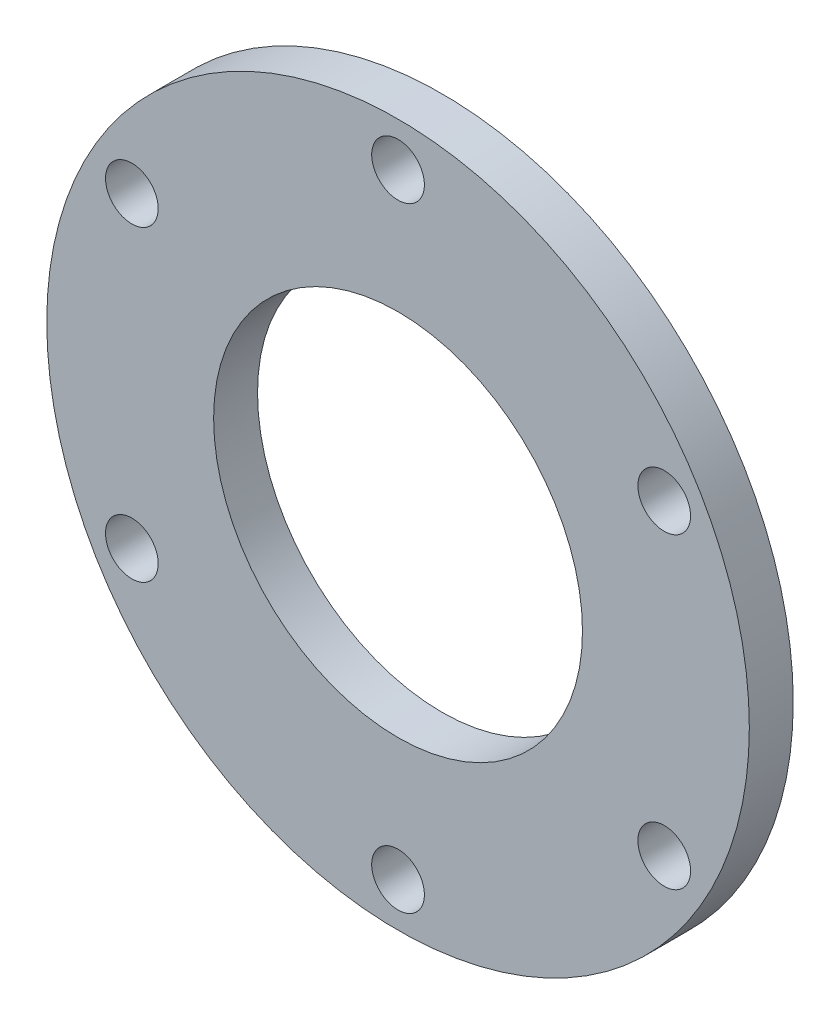
ISO-10303-21;
HEADER;
FILE_DESCRIPTION(('STEP AP214'),'2;1');
FILE_NAME('part.step','',(''),(''),'','','');
FILE_SCHEMA(('AUTOMOTIVE_DESIGN { 1 0 10303 214 1 1 1 1 }'));
ENDSEC;
DATA;
#1=APPLICATION_CONTEXT('core data for automotive mechanical design processes');
#2=APPLICATION_PROTOCOL_DEFINITION('international standard','automotive_design',2000,#1);
#3=PRODUCT_CONTEXT('',#1,'mechanical');
#4=PRODUCT('Part','Part','',(#3));
#5=PRODUCT_RELATED_PRODUCT_CATEGORY('part','',(#4));
#6=PRODUCT_DEFINITION_FORMATION('','',#4);
#7=PRODUCT_DEFINITION_CONTEXT('part definition',#1,'design');
#8=PRODUCT_DEFINITION('design','',#6,#7);
#9=PRODUCT_DEFINITION_SHAPE('','',#8);
#10=(LENGTH_UNIT() NAMED_UNIT(*) SI_UNIT(.MILLI.,.METRE.));
#11=(NAMED_UNIT(*) PLANE_ANGLE_UNIT() SI_UNIT($,.RADIAN.));
#12=(NAMED_UNIT(*) SI_UNIT($,.STERADIAN.) SOLID_ANGLE_UNIT());
#13=UNCERTAINTY_MEASURE_WITH_UNIT(LENGTH_MEASURE(1.E-05),#10,'distance_accuracy_value','');
#14=(GEOMETRIC_REPRESENTATION_CONTEXT(3) GLOBAL_UNCERTAINTY_ASSIGNED_CONTEXT((#13)) GLOBAL_UNIT_ASSIGNED_CONTEXT((#10,
#11,#12)) REPRESENTATION_CONTEXT('',''));
#15=CARTESIAN_POINT('',(0.,0.,0.));
#16=DIRECTION('',(0.,0.,1.));
#17=DIRECTION('',(1.,0.,0.));
#18=AXIS2_PLACEMENT_3D('',#15,#16,#17);
#19=CARTESIAN_POINT('',(0.,0.,-3.175));
#20=DIRECTION('',(0.,0.,1.));
#21=DIRECTION('',(1.,0.,0.));
#22=AXIS2_PLACEMENT_3D('',#19,#20,#21);
#23=CYLINDRICAL_SURFACE('',#22,25.4);
#24=CARTESIAN_POINT('',(0.,0.,-3.175));
#25=DIRECTION('',(0.,0.,1.));
#26=DIRECTION('',(1.,0.,0.));
#27=AXIS2_PLACEMENT_3D('',#24,#25,#26);
#28=CIRCLE('',#27,25.4);
#29=CARTESIAN_POINT('',(25.4,0.,-3.175));
#30=VERTEX_POINT('',#29);
#31=EDGE_CURVE('E10',#30,#30,#28,.T.);
#32=ORIENTED_EDGE('',*,*,#31,.T.);
#33=EDGE_LOOP('',(#32));
#34=FACE_BOUND('',#33,.T.);
#35=CARTESIAN_POINT('',(0.,0.,0.));
#36=DIRECTION('',(0.,0.,1.));
#37=DIRECTION('',(1.,0.,0.));
#38=AXIS2_PLACEMENT_3D('',#35,#36,#37);
#39=CIRCLE('',#38,25.4);
#40=CARTESIAN_POINT('',(25.4,0.,0.));
#41=VERTEX_POINT('',#40);
#42=EDGE_CURVE('E38',#41,#41,#39,.T.);
#43=ORIENTED_EDGE('',*,*,#42,.F.);
#44=EDGE_LOOP('',(#43));
#45=FACE_BOUND('',#44,.T.);
#46=ADVANCED_FACE('F35',(#34,#45),#23,.T.);
#47=CARTESIAN_POINT('',(0.,0.,-3.175));
#48=DIRECTION('',(0.,0.,1.));
#49=DIRECTION('',(1.,0.,0.));
#50=AXIS2_PLACEMENT_3D('',#47,#48,#49);
#51=PLANE('',#50);
#52=CARTESIAN_POINT('',(-19.2474145991092,11.1125,-3.175));
#53=DIRECTION('',(0.,0.,1.));
#54=DIRECTION('',(1.,0.,0.));
#55=AXIS2_PLACEMENT_3D('',#52,#53,#54);
#56=CIRCLE('',#55,1.905);
#57=CARTESIAN_POINT('',(-17.3424145991092,11.1125,-3.175));
#58=VERTEX_POINT('',#57);
#59=EDGE_CURVE('E80',#58,#58,#56,.T.);
#60=ORIENTED_EDGE('',*,*,#59,.T.);
#61=EDGE_LOOP('',(#60));
#62=FACE_BOUND('',#61,.T.);
#63=CARTESIAN_POINT('',(-19.2474145991091,-11.1125,-3.175));
#64=DIRECTION('',(0.,0.,1.));
#65=DIRECTION('',(1.,0.,0.));
#66=AXIS2_PLACEMENT_3D('',#63,#64,#65);
#67=CIRCLE('',#66,1.905);
#68=CARTESIAN_POINT('',(-17.3424145991091,-11.1125,-3.175));
#69=VERTEX_POINT('',#68);
#70=EDGE_CURVE('E74',#69,#69,#67,.T.);
#71=ORIENTED_EDGE('',*,*,#70,.T.);
#72=EDGE_LOOP('',(#71));
#73=FACE_BOUND('',#72,.T.);
#74=CARTESIAN_POINT('',(0.,-22.225,-3.175));
#75=DIRECTION('',(0.,0.,1.));
#76=DIRECTION('',(1.,0.,0.));
#77=AXIS2_PLACEMENT_3D('',#74,#75,#76);
#78=CIRCLE('',#77,1.905);
#79=CARTESIAN_POINT('',(1.905,-22.225,-3.175));
#80=VERTEX_POINT('',#79);
#81=EDGE_CURVE('E68',#80,#80,#78,.T.);
#82=ORIENTED_EDGE('',*,*,#81,.T.);
#83=EDGE_LOOP('',(#82));
#84=FACE_BOUND('',#83,.T.);
#85=CARTESIAN_POINT('',(19.2474145991092,-11.1125,-3.175));
#86=DIRECTION('',(0.,0.,1.));
#87=DIRECTION('',(1.,0.,0.));
#88=AXIS2_PLACEMENT_3D('',#85,#86,#87);
#89=CIRCLE('',#88,1.905);
#90=CARTESIAN_POINT('',(21.1524145991092,-11.1125,-3.175));
#91=VERTEX_POINT('',#90);
#92=EDGE_CURVE('E62',#91,#91,#89,.T.);
#93=ORIENTED_EDGE('',*,*,#92,.T.);
#94=EDGE_LOOP('',(#93));
#95=FACE_BOUND('',#94,.T.);
#96=CARTESIAN_POINT('',(19.2474145991091,11.1125,-3.175));
#97=DIRECTION('',(0.,0.,1.));
#98=DIRECTION('',(1.,0.,0.));
#99=AXIS2_PLACEMENT_3D('',#96,#97,#98);
#100=CIRCLE('',#99,1.905);
#101=CARTESIAN_POINT('',(21.1524145991091,11.1125,-3.175));
#102=VERTEX_POINT('',#101);
#103=EDGE_CURVE('E56',#102,#102,#100,.T.);
#104=ORIENTED_EDGE('',*,*,#103,.T.);
#105=EDGE_LOOP('',(#104));
#106=FACE_BOUND('',#105,.T.);
#107=CARTESIAN_POINT('',(0.,22.225,-3.175));
#108=DIRECTION('',(0.,0.,1.));
#109=DIRECTION('',(1.,0.,0.));
#110=AXIS2_PLACEMENT_3D('',#107,#108,#109);
#111=CIRCLE('',#110,1.905);
#112=CARTESIAN_POINT('',(1.905,22.225,-3.175));
#113=VERTEX_POINT('',#112);
#114=EDGE_CURVE('E50',#113,#113,#111,.T.);
#115=ORIENTED_EDGE('',*,*,#114,.T.);
#116=EDGE_LOOP('',(#115));
#117=FACE_BOUND('',#116,.T.);
#118=CARTESIAN_POINT('',(0.,0.,-3.175));
#119=DIRECTION('',(0.,0.,1.));
#120=DIRECTION('',(1.,0.,0.));
#121=AXIS2_PLACEMENT_3D('',#118,#119,#120);
#122=CIRCLE('',#121,13.335);
#123=CARTESIAN_POINT('',(13.335,0.,-3.175));
#124=VERTEX_POINT('',#123);
#125=EDGE_CURVE('E45',#124,#124,#122,.T.);
#126=ORIENTED_EDGE('',*,*,#125,.T.);
#127=EDGE_LOOP('',(#126));
#128=FACE_BOUND('',#127,.T.);
#129=ORIENTED_EDGE('',*,*,#31,.F.);
#130=EDGE_LOOP('',(#129));
#131=FACE_BOUND('',#130,.T.);
#132=ADVANCED_FACE('F89',(#62,#73,#84,#95,#106,#117,#128,#131),#51,.F.);
#133=CARTESIAN_POINT('',(0.,0.,0.));
#134=DIRECTION('',(0.,0.,1.));
#135=DIRECTION('',(1.,0.,0.));
#136=AXIS2_PLACEMENT_3D('',#133,#134,#135);
#137=PLANE('',#136);
#138=CARTESIAN_POINT('',(-19.2474145991092,11.1125,0.));
#139=DIRECTION('',(0.,0.,1.));
#140=DIRECTION('',(1.,0.,0.));
#141=AXIS2_PLACEMENT_3D('',#138,#139,#140);
#142=CIRCLE('',#141,1.905);
#143=CARTESIAN_POINT('',(-17.3424145991092,11.1125,0.));
#144=VERTEX_POINT('',#143);
#145=EDGE_CURVE('E83',#144,#144,#142,.T.);
#146=ORIENTED_EDGE('',*,*,#145,.F.);
#147=EDGE_LOOP('',(#146));
#148=FACE_BOUND('',#147,.T.);
#149=CARTESIAN_POINT('',(-19.2474145991091,-11.1125,0.));
#150=DIRECTION('',(0.,0.,1.));
#151=DIRECTION('',(1.,0.,0.));
#152=AXIS2_PLACEMENT_3D('',#149,#150,#151);
#153=CIRCLE('',#152,1.905);
#154=CARTESIAN_POINT('',(-17.3424145991091,-11.1125,0.));
#155=VERTEX_POINT('',#154);
#156=EDGE_CURVE('E77',#155,#155,#153,.T.);
#157=ORIENTED_EDGE('',*,*,#156,.F.);
#158=EDGE_LOOP('',(#157));
#159=FACE_BOUND('',#158,.T.);
#160=CARTESIAN_POINT('',(0.,-22.225,0.));
#161=DIRECTION('',(0.,0.,1.));
#162=DIRECTION('',(1.,0.,0.));
#163=AXIS2_PLACEMENT_3D('',#160,#161,#162);
#164=CIRCLE('',#163,1.905);
#165=CARTESIAN_POINT('',(1.905,-22.225,0.));
#166=VERTEX_POINT('',#165);
#167=EDGE_CURVE('E71',#166,#166,#164,.T.);
#168=ORIENTED_EDGE('',*,*,#167,.F.);
#169=EDGE_LOOP('',(#168));
#170=FACE_BOUND('',#169,.T.);
#171=CARTESIAN_POINT('',(19.2474145991092,-11.1125,0.));
#172=DIRECTION('',(0.,0.,1.));
#173=DIRECTION('',(1.,0.,0.));
#174=AXIS2_PLACEMENT_3D('',#171,#172,#173);
#175=CIRCLE('',#174,1.905);
#176=CARTESIAN_POINT('',(21.1524145991092,-11.1125,0.));
#177=VERTEX_POINT('',#176);
#178=EDGE_CURVE('E65',#177,#177,#175,.T.);
#179=ORIENTED_EDGE('',*,*,#178,.F.);
#180=EDGE_LOOP('',(#179));
#181=FACE_BOUND('',#180,.T.);
#182=CARTESIAN_POINT('',(19.2474145991091,11.1125,0.));
#183=DIRECTION('',(0.,0.,1.));
#184=DIRECTION('',(1.,0.,0.));
#185=AXIS2_PLACEMENT_3D('',#182,#183,#184);
#186=CIRCLE('',#185,1.905);
#187=CARTESIAN_POINT('',(21.1524145991091,11.1125,0.));
#188=VERTEX_POINT('',#187);
#189=EDGE_CURVE('E59',#188,#188,#186,.T.);
#190=ORIENTED_EDGE('',*,*,#189,.F.);
#191=EDGE_LOOP('',(#190));
#192=FACE_BOUND('',#191,.T.);
#193=CARTESIAN_POINT('',(0.,22.225,0.));
#194=DIRECTION('',(0.,0.,1.));
#195=DIRECTION('',(1.,0.,0.));
#196=AXIS2_PLACEMENT_3D('',#193,#194,#195);
#197=CIRCLE('',#196,1.905);
#198=CARTESIAN_POINT('',(1.905,22.225,0.));
#199=VERTEX_POINT('',#198);
#200=EDGE_CURVE('E53',#199,#199,#197,.T.);
#201=ORIENTED_EDGE('',*,*,#200,.F.);
#202=EDGE_LOOP('',(#201));
#203=FACE_BOUND('',#202,.T.);
#204=CARTESIAN_POINT('',(0.,0.,0.));
#205=DIRECTION('',(0.,0.,1.));
#206=DIRECTION('',(1.,0.,0.));
#207=AXIS2_PLACEMENT_3D('',#204,#205,#206);
#208=CIRCLE('',#207,13.335);
#209=CARTESIAN_POINT('',(13.335,0.,0.));
#210=VERTEX_POINT('',#209);
#211=EDGE_CURVE('E47',#210,#210,#208,.T.);
#212=ORIENTED_EDGE('',*,*,#211,.F.);
#213=EDGE_LOOP('',(#212));
#214=FACE_BOUND('',#213,.T.);
#215=ORIENTED_EDGE('',*,*,#42,.T.);
#216=EDGE_LOOP('',(#215));
#217=FACE_BOUND('',#216,.T.);
#218=ADVANCED_FACE('F99',(#148,#159,#170,#181,#192,#203,#214,#217),#137,.T.);
#219=CARTESIAN_POINT('',(0.,0.,-3.175));
#220=DIRECTION('',(0.,0.,1.));
#221=DIRECTION('',(1.,0.,0.));
#222=AXIS2_PLACEMENT_3D('',#219,#220,#221);
#223=CYLINDRICAL_SURFACE('',#222,13.335);
#224=ORIENTED_EDGE('',*,*,#125,.F.);
#225=EDGE_LOOP('',(#224));
#226=FACE_BOUND('',#225,.T.);
#227=ORIENTED_EDGE('',*,*,#211,.T.);
#228=EDGE_LOOP('',(#227));
#229=FACE_BOUND('',#228,.T.);
#230=ADVANCED_FACE('F102',(#226,#229),#223,.F.);
#231=CARTESIAN_POINT('',(0.,22.225,-3.175));
#232=DIRECTION('',(0.,0.,1.));
#233=DIRECTION('',(1.,0.,0.));
#234=AXIS2_PLACEMENT_3D('',#231,#232,#233);
#235=CYLINDRICAL_SURFACE('',#234,1.905);
#236=ORIENTED_EDGE('',*,*,#114,.F.);
#237=EDGE_LOOP('',(#236));
#238=FACE_BOUND('',#237,.T.);
#239=ORIENTED_EDGE('',*,*,#200,.T.);
#240=EDGE_LOOP('',(#239));
#241=FACE_BOUND('',#240,.T.);
#242=ADVANCED_FACE('F127',(#238,#241),#235,.F.);
#243=CARTESIAN_POINT('',(19.2474145991091,11.1125,-3.175));
#244=DIRECTION('',(0.,0.,1.));
#245=DIRECTION('',(1.,0.,0.));
#246=AXIS2_PLACEMENT_3D('',#243,#244,#245);
#247=CYLINDRICAL_SURFACE('',#246,1.905);
#248=ORIENTED_EDGE('',*,*,#103,.F.);
#249=EDGE_LOOP('',(#248));
#250=FACE_BOUND('',#249,.T.);
#251=ORIENTED_EDGE('',*,*,#189,.T.);
#252=EDGE_LOOP('',(#251));
#253=FACE_BOUND('',#252,.T.);
#254=ADVANCED_FACE('F131',(#250,#253),#247,.F.);
#255=CARTESIAN_POINT('',(19.2474145991092,-11.1125,-3.175));
#256=DIRECTION('',(0.,0.,1.));
#257=DIRECTION('',(1.,0.,0.));
#258=AXIS2_PLACEMENT_3D('',#255,#256,#257);
#259=CYLINDRICAL_SURFACE('',#258,1.905);
#260=ORIENTED_EDGE('',*,*,#92,.F.);
#261=EDGE_LOOP('',(#260));
#262=FACE_BOUND('',#261,.T.);
#263=ORIENTED_EDGE('',*,*,#178,.T.);
#264=EDGE_LOOP('',(#263));
#265=FACE_BOUND('',#264,.T.);
#266=ADVANCED_FACE('F135',(#262,#265),#259,.F.);
#267=CARTESIAN_POINT('',(0.,-22.225,-3.175));
#268=DIRECTION('',(0.,0.,1.));
#269=DIRECTION('',(1.,0.,0.));
#270=AXIS2_PLACEMENT_3D('',#267,#268,#269);
#271=CYLINDRICAL_SURFACE('',#270,1.905);
#272=ORIENTED_EDGE('',*,*,#81,.F.);
#273=EDGE_LOOP('',(#272));
#274=FACE_BOUND('',#273,.T.);
#275=ORIENTED_EDGE('',*,*,#167,.T.);
#276=EDGE_LOOP('',(#275));
#277=FACE_BOUND('',#276,.T.);
#278=ADVANCED_FACE('F139',(#274,#277),#271,.F.);
#279=CARTESIAN_POINT('',(-19.2474145991091,-11.1125,-3.175));
#280=DIRECTION('',(0.,0.,1.));
#281=DIRECTION('',(1.,0.,0.));
#282=AXIS2_PLACEMENT_3D('',#279,#280,#281);
#283=CYLINDRICAL_SURFACE('',#282,1.905);
#284=ORIENTED_EDGE('',*,*,#70,.F.);
#285=EDGE_LOOP('',(#284));
#286=FACE_BOUND('',#285,.T.);
#287=ORIENTED_EDGE('',*,*,#156,.T.);
#288=EDGE_LOOP('',(#287));
#289=FACE_BOUND('',#288,.T.);
#290=ADVANCED_FACE('F95',(#286,#289),#283,.F.);
#291=CARTESIAN_POINT('',(-19.2474145991092,11.1125,-3.175));
#292=DIRECTION('',(0.,0.,1.));
#293=DIRECTION('',(1.,0.,0.));
#294=AXIS2_PLACEMENT_3D('',#291,#292,#293);
#295=CYLINDRICAL_SURFACE('',#294,1.905);
#296=ORIENTED_EDGE('',*,*,#59,.F.);
#297=EDGE_LOOP('',(#296));
#298=FACE_BOUND('',#297,.T.);
#299=ORIENTED_EDGE('',*,*,#145,.T.);
#300=EDGE_LOOP('',(#299));
#301=FACE_BOUND('',#300,.T.);
#302=ADVANCED_FACE('F92',(#298,#301),#295,.F.);
#303=CLOSED_SHELL('',(#46,#132,#218,#230,#242,#254,#266,#278,#290,#302));
#304=MANIFOLD_SOLID_BREP('B2',#303);
#305=ADVANCED_BREP_SHAPE_REPRESENTATION('',(#18,#304),#14);
#306=SHAPE_DEFINITION_REPRESENTATION(#9,#305);
ENDSEC;
END-ISO-10303-21;
